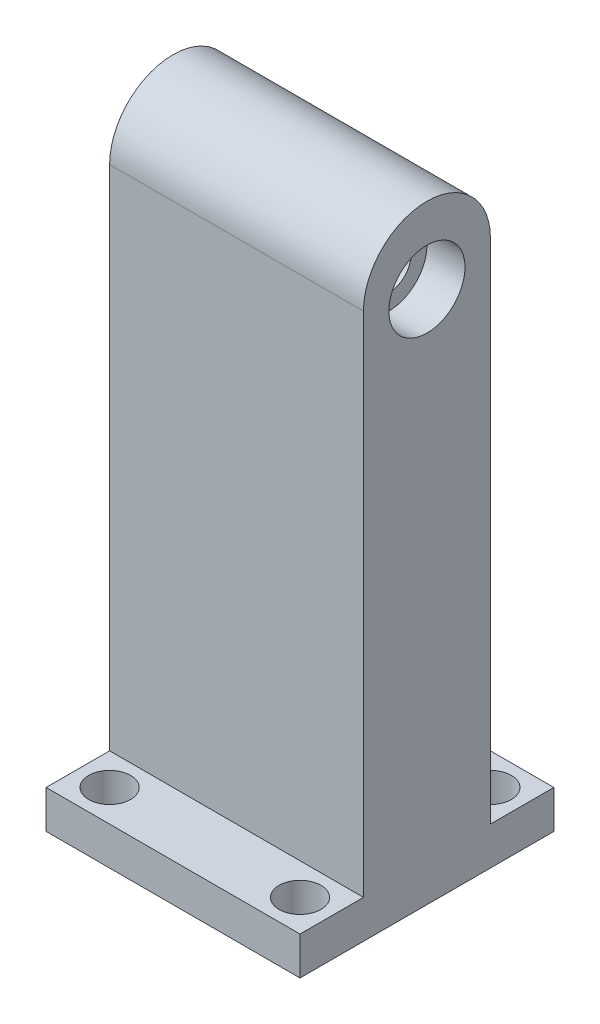
ISO-10303-21;
HEADER;
FILE_DESCRIPTION(('STEP AP214'),'2;1');
FILE_NAME('part.step','',(''),(''),'','','');
FILE_SCHEMA(('AUTOMOTIVE_DESIGN { 1 0 10303 214 1 1 1 1 }'));
ENDSEC;
DATA;
#1=APPLICATION_CONTEXT('core data for automotive mechanical design processes');
#2=APPLICATION_PROTOCOL_DEFINITION('international standard','automotive_design',2000,#1);
#3=PRODUCT_CONTEXT('',#1,'mechanical');
#4=PRODUCT('Part','Part','',(#3));
#5=PRODUCT_RELATED_PRODUCT_CATEGORY('part','',(#4));
#6=PRODUCT_DEFINITION_FORMATION('','',#4);
#7=PRODUCT_DEFINITION_CONTEXT('part definition',#1,'design');
#8=PRODUCT_DEFINITION('design','',#6,#7);
#9=PRODUCT_DEFINITION_SHAPE('','',#8);
#10=(LENGTH_UNIT() NAMED_UNIT(*) SI_UNIT(.MILLI.,.METRE.));
#11=(NAMED_UNIT(*) PLANE_ANGLE_UNIT() SI_UNIT($,.RADIAN.));
#12=(NAMED_UNIT(*) SI_UNIT($,.STERADIAN.) SOLID_ANGLE_UNIT());
#13=UNCERTAINTY_MEASURE_WITH_UNIT(LENGTH_MEASURE(1.E-05),#10,'distance_accuracy_value','');
#14=(GEOMETRIC_REPRESENTATION_CONTEXT(3) GLOBAL_UNCERTAINTY_ASSIGNED_CONTEXT((#13)) GLOBAL_UNIT_ASSIGNED_CONTEXT((#10,
#11,#12)) REPRESENTATION_CONTEXT('',''));
#15=CARTESIAN_POINT('',(0.,0.,0.));
#16=DIRECTION('',(0.,0.,1.));
#17=DIRECTION('',(1.,0.,0.));
#18=AXIS2_PLACEMENT_3D('',#15,#16,#17);
#19=CARTESIAN_POINT('',(-10.,42.,0.));
#20=DIRECTION('',(1.,0.,0.));
#21=DIRECTION('',(0.,0.,-1.));
#22=AXIS2_PLACEMENT_3D('',#19,#20,#21);
#23=CYLINDRICAL_SURFACE('',#22,1.75);
#24=CARTESIAN_POINT('',(7.,42.,0.));
#25=DIRECTION('',(1.,0.,0.));
#26=DIRECTION('',(0.,0.,-1.));
#27=AXIS2_PLACEMENT_3D('',#24,#25,#26);
#28=CIRCLE('',#27,1.75);
#29=CARTESIAN_POINT('',(7.,42.,-1.75));
#30=VERTEX_POINT('',#29);
#31=EDGE_CURVE('E167',#30,#30,#28,.T.);
#32=ORIENTED_EDGE('',*,*,#31,.T.);
#33=EDGE_LOOP('',(#32));
#34=FACE_BOUND('',#33,.T.);
#35=CARTESIAN_POINT('',(-7.,42.,0.));
#36=DIRECTION('',(-1.,0.,0.));
#37=DIRECTION('',(0.,0.,1.));
#38=AXIS2_PLACEMENT_3D('',#35,#36,#37);
#39=CIRCLE('',#38,1.75);
#40=CARTESIAN_POINT('',(-7.,42.,1.75));
#41=VERTEX_POINT('',#40);
#42=EDGE_CURVE('E164',#41,#41,#39,.F.);
#43=ORIENTED_EDGE('',*,*,#42,.F.);
#44=EDGE_LOOP('',(#43));
#45=FACE_BOUND('',#44,.T.);
#46=ADVANCED_FACE('F43',(#34,#45),#23,.F.);
#47=CARTESIAN_POINT('',(10.,52.,-9.99999999999999));
#48=DIRECTION('',(-1.,0.,0.));
#49=DIRECTION('',(0.,0.,1.));
#50=AXIS2_PLACEMENT_3D('',#47,#48,#49);
#51=PLANE('',#50);
#52=CARTESIAN_POINT('',(10.,42.,0.));
#53=DIRECTION('',(1.,0.,0.));
#54=DIRECTION('',(0.,0.,-1.));
#55=AXIS2_PLACEMENT_3D('',#52,#53,#54);
#56=CIRCLE('',#55,3.);
#57=CARTESIAN_POINT('',(10.,42.,-3.));
#58=VERTEX_POINT('',#57);
#59=EDGE_CURVE('E147',#58,#58,#56,.T.);
#60=ORIENTED_EDGE('',*,*,#59,.F.);
#61=EDGE_LOOP('',(#60));
#62=FACE_BOUND('',#61,.T.);
#63=DIRECTION('',(0.,-1.,0.));
#64=VECTOR('',#63,1.);
#65=CARTESIAN_POINT('',(10.,43.,4.99999999999999));
#66=LINE('',#65,#64);
#67=CARTESIAN_POINT('',(10.,43.,4.99999999999999));
#68=VERTEX_POINT('',#67);
#69=CARTESIAN_POINT('',(10.,3.,5.));
#70=VERTEX_POINT('',#69);
#71=EDGE_CURVE('E297',#68,#70,#66,.T.);
#72=ORIENTED_EDGE('',*,*,#71,.T.);
#73=DIRECTION('',(0.,0.,1.));
#74=VECTOR('',#73,1.);
#75=CARTESIAN_POINT('',(10.,3.,5.));
#76=LINE('',#75,#74);
#77=CARTESIAN_POINT('',(10.,3.,10.));
#78=VERTEX_POINT('',#77);
#79=EDGE_CURVE('E131',#70,#78,#76,.T.);
#80=ORIENTED_EDGE('',*,*,#79,.T.);
#81=DIRECTION('',(0.,-1.,0.));
#82=VECTOR('',#81,1.);
#83=CARTESIAN_POINT('',(10.,52.,10.));
#84=LINE('',#83,#82);
#85=CARTESIAN_POINT('',(10.,0.,10.));
#86=VERTEX_POINT('',#85);
#87=EDGE_CURVE('E69',#78,#86,#84,.T.);
#88=ORIENTED_EDGE('',*,*,#87,.T.);
#89=DIRECTION('',(0.,0.,-1.));
#90=VECTOR('',#89,1.);
#91=CARTESIAN_POINT('',(10.,0.,-9.99999999999999));
#92=LINE('',#91,#90);
#93=CARTESIAN_POINT('',(10.,0.,-9.99999999999999));
#94=VERTEX_POINT('',#93);
#95=EDGE_CURVE('E135',#86,#94,#92,.T.);
#96=ORIENTED_EDGE('',*,*,#95,.T.);
#97=DIRECTION('',(0.,-1.,0.));
#98=VECTOR('',#97,1.);
#99=CARTESIAN_POINT('',(10.,52.,-9.99999999999999));
#100=LINE('',#99,#98);
#101=CARTESIAN_POINT('',(10.,3.,-10.));
#102=VERTEX_POINT('',#101);
#103=EDGE_CURVE('E11',#102,#94,#100,.T.);
#104=ORIENTED_EDGE('',*,*,#103,.F.);
#105=DIRECTION('',(0.,0.,1.));
#106=VECTOR('',#105,1.);
#107=CARTESIAN_POINT('',(10.,3.,-10.));
#108=LINE('',#107,#106);
#109=CARTESIAN_POINT('',(10.,3.,-5.));
#110=VERTEX_POINT('',#109);
#111=EDGE_CURVE('E111',#102,#110,#108,.T.);
#112=ORIENTED_EDGE('',*,*,#111,.T.);
#113=DIRECTION('',(0.,1.,0.));
#114=VECTOR('',#113,1.);
#115=CARTESIAN_POINT('',(10.,3.,-5.));
#116=LINE('',#115,#114);
#117=CARTESIAN_POINT('',(10.,43.,-5.00000000000001));
#118=VERTEX_POINT('',#117);
#119=EDGE_CURVE('E123',#110,#118,#116,.T.);
#120=ORIENTED_EDGE('',*,*,#119,.T.);
#121=CARTESIAN_POINT('',(10.,43.,0.));
#122=DIRECTION('',(1.,0.,0.));
#123=DIRECTION('',(0.,0.,-1.));
#124=AXIS2_PLACEMENT_3D('',#121,#122,#123);
#125=CIRCLE('',#124,5.);
#126=EDGE_CURVE('E293',#118,#68,#125,.T.);
#127=ORIENTED_EDGE('',*,*,#126,.T.);
#128=EDGE_LOOP('',(#72,#80,#88,#96,#104,#112,#120,#127));
#129=FACE_BOUND('',#128,.T.);
#130=ADVANCED_FACE('F45',(#62,#129),#51,.F.);
#131=CARTESIAN_POINT('',(-10.,52.,-9.99999999999999));
#132=DIRECTION('',(0.,0.,1.));
#133=DIRECTION('',(1.,0.,0.));
#134=AXIS2_PLACEMENT_3D('',#131,#132,#133);
#135=PLANE('',#134);
#136=DIRECTION('',(0.,-1.,0.));
#137=VECTOR('',#136,1.);
#138=CARTESIAN_POINT('',(-10.,52.,-9.99999999999999));
#139=LINE('',#138,#137);
#140=CARTESIAN_POINT('',(-10.,3.,-9.99999999999999));
#141=VERTEX_POINT('',#140);
#142=CARTESIAN_POINT('',(-10.,0.,-9.99999999999999));
#143=VERTEX_POINT('',#142);
#144=EDGE_CURVE('E53',#141,#143,#139,.T.);
#145=ORIENTED_EDGE('',*,*,#144,.F.);
#146=DIRECTION('',(-1.,0.,0.));
#147=VECTOR('',#146,1.);
#148=CARTESIAN_POINT('',(10.,3.,-10.));
#149=LINE('',#148,#147);
#150=EDGE_CURVE('E116',#102,#141,#149,.T.);
#151=ORIENTED_EDGE('',*,*,#150,.F.);
#152=ORIENTED_EDGE('',*,*,#103,.T.);
#153=DIRECTION('',(-1.,0.,0.));
#154=VECTOR('',#153,1.);
#155=CARTESIAN_POINT('',(-10.,0.,-9.99999999999999));
#156=LINE('',#155,#154);
#157=EDGE_CURVE('E139',#94,#143,#156,.T.);
#158=ORIENTED_EDGE('',*,*,#157,.T.);
#159=EDGE_LOOP('',(#145,#151,#152,#158));
#160=FACE_BOUND('',#159,.T.);
#161=ADVANCED_FACE('F127',(#160),#135,.F.);
#162=CARTESIAN_POINT('',(-10.,52.,-9.99999999999999));
#163=DIRECTION('',(1.,0.,0.));
#164=DIRECTION('',(0.,0.,-1.));
#165=AXIS2_PLACEMENT_3D('',#162,#163,#164);
#166=PLANE('',#165);
#167=CARTESIAN_POINT('',(-10.,42.,0.));
#168=DIRECTION('',(-1.,0.,0.));
#169=DIRECTION('',(0.,0.,1.));
#170=AXIS2_PLACEMENT_3D('',#167,#168,#169);
#171=CIRCLE('',#170,3.);
#172=CARTESIAN_POINT('',(-10.,42.,3.));
#173=VERTEX_POINT('',#172);
#174=EDGE_CURVE('E217',#173,#173,#171,.T.);
#175=ORIENTED_EDGE('',*,*,#174,.F.);
#176=EDGE_LOOP('',(#175));
#177=FACE_BOUND('',#176,.T.);
#178=DIRECTION('',(0.,-1.,0.));
#179=VECTOR('',#178,1.);
#180=CARTESIAN_POINT('',(-10.,52.,10.));
#181=LINE('',#180,#179);
#182=CARTESIAN_POINT('',(-10.,3.00000000000002,10.));
#183=VERTEX_POINT('',#182);
#184=CARTESIAN_POINT('',(-10.,0.,10.));
#185=VERTEX_POINT('',#184);
#186=EDGE_CURVE('E159',#183,#185,#181,.T.);
#187=ORIENTED_EDGE('',*,*,#186,.F.);
#188=DIRECTION('',(0.,0.,1.));
#189=VECTOR('',#188,1.);
#190=CARTESIAN_POINT('',(-10.,3.,5.));
#191=LINE('',#190,#189);
#192=CARTESIAN_POINT('',(-10.,3.,5.));
#193=VERTEX_POINT('',#192);
#194=EDGE_CURVE('E61',#193,#183,#191,.T.);
#195=ORIENTED_EDGE('',*,*,#194,.F.);
#196=DIRECTION('',(0.,-1.,0.));
#197=VECTOR('',#196,1.);
#198=CARTESIAN_POINT('',(-10.,43.,4.99999999999999));
#199=LINE('',#198,#197);
#200=CARTESIAN_POINT('',(-10.,43.,4.99999999999999));
#201=VERTEX_POINT('',#200);
#202=EDGE_CURVE('E286',#201,#193,#199,.T.);
#203=ORIENTED_EDGE('',*,*,#202,.F.);
#204=CARTESIAN_POINT('',(-10.,43.,0.));
#205=DIRECTION('',(1.,0.,0.));
#206=DIRECTION('',(0.,0.,-1.));
#207=AXIS2_PLACEMENT_3D('',#204,#205,#206);
#208=CIRCLE('',#207,5.);
#209=CARTESIAN_POINT('',(-10.,43.,-5.00000000000001));
#210=VERTEX_POINT('',#209);
#211=EDGE_CURVE('E279',#210,#201,#208,.T.);
#212=ORIENTED_EDGE('',*,*,#211,.F.);
#213=DIRECTION('',(0.,1.,0.));
#214=VECTOR('',#213,1.);
#215=CARTESIAN_POINT('',(-10.,3.,-5.));
#216=LINE('',#215,#214);
#217=CARTESIAN_POINT('',(-10.,3.,-5.));
#218=VERTEX_POINT('',#217);
#219=EDGE_CURVE('E275',#218,#210,#216,.T.);
#220=ORIENTED_EDGE('',*,*,#219,.F.);
#221=DIRECTION('',(0.,0.,1.));
#222=VECTOR('',#221,1.);
#223=CARTESIAN_POINT('',(-10.,3.,-9.99999999999999));
#224=LINE('',#223,#222);
#225=EDGE_CURVE('E272',#141,#218,#224,.T.);
#226=ORIENTED_EDGE('',*,*,#225,.F.);
#227=ORIENTED_EDGE('',*,*,#144,.T.);
#228=DIRECTION('',(0.,0.,1.));
#229=VECTOR('',#228,1.);
#230=CARTESIAN_POINT('',(-10.,0.,-9.99999999999999));
#231=LINE('',#230,#229);
#232=EDGE_CURVE('E144',#143,#185,#231,.T.);
#233=ORIENTED_EDGE('',*,*,#232,.T.);
#234=EDGE_LOOP('',(#187,#195,#203,#212,#220,#226,#227,#233));
#235=FACE_BOUND('',#234,.T.);
#236=ADVANCED_FACE('F239',(#177,#235),#166,.F.);
#237=CARTESIAN_POINT('',(-10.,52.,10.));
#238=DIRECTION('',(0.,0.,-1.));
#239=DIRECTION('',(-1.,0.,0.));
#240=AXIS2_PLACEMENT_3D('',#237,#238,#239);
#241=PLANE('',#240);
#242=ORIENTED_EDGE('',*,*,#87,.F.);
#243=DIRECTION('',(-1.,0.,0.));
#244=VECTOR('',#243,1.);
#245=CARTESIAN_POINT('',(10.,3.,10.));
#246=LINE('',#245,#244);
#247=EDGE_CURVE('E173',#78,#183,#246,.T.);
#248=ORIENTED_EDGE('',*,*,#247,.T.);
#249=ORIENTED_EDGE('',*,*,#186,.T.);
#250=DIRECTION('',(1.,0.,0.));
#251=VECTOR('',#250,1.);
#252=CARTESIAN_POINT('',(-10.,0.,10.));
#253=LINE('',#252,#251);
#254=EDGE_CURVE('E154',#185,#86,#253,.T.);
#255=ORIENTED_EDGE('',*,*,#254,.T.);
#256=EDGE_LOOP('',(#242,#248,#249,#255));
#257=FACE_BOUND('',#256,.T.);
#258=ADVANCED_FACE('F259',(#257),#241,.F.);
#259=CARTESIAN_POINT('',(0.,0.,0.));
#260=DIRECTION('',(0.,1.,0.));
#261=DIRECTION('',(0.,0.,1.));
#262=AXIS2_PLACEMENT_3D('',#259,#260,#261);
#263=PLANE('',#262);
#264=CARTESIAN_POINT('',(-7.5,0.,7.50000000000001));
#265=DIRECTION('',(0.,1.,0.));
#266=DIRECTION('',(0.,0.,1.));
#267=AXIS2_PLACEMENT_3D('',#264,#265,#266);
#268=CIRCLE('',#267,1.64955961301493);
#269=CARTESIAN_POINT('',(-7.5,0.,9.14955961301494));
#270=VERTEX_POINT('',#269);
#271=EDGE_CURVE('E201',#270,#270,#268,.T.);
#272=ORIENTED_EDGE('',*,*,#271,.T.);
#273=EDGE_LOOP('',(#272));
#274=FACE_BOUND('',#273,.T.);
#275=CARTESIAN_POINT('',(7.5,0.,7.50000000000001));
#276=DIRECTION('',(0.,1.,0.));
#277=DIRECTION('',(0.,0.,1.));
#278=AXIS2_PLACEMENT_3D('',#275,#276,#277);
#279=CIRCLE('',#278,1.64955961301494);
#280=CARTESIAN_POINT('',(7.5,0.,9.14955961301494));
#281=VERTEX_POINT('',#280);
#282=EDGE_CURVE('E207',#281,#281,#279,.T.);
#283=ORIENTED_EDGE('',*,*,#282,.T.);
#284=EDGE_LOOP('',(#283));
#285=FACE_BOUND('',#284,.T.);
#286=CARTESIAN_POINT('',(7.5,0.,-7.49999999999999));
#287=DIRECTION('',(0.,1.,0.));
#288=DIRECTION('',(0.,0.,1.));
#289=AXIS2_PLACEMENT_3D('',#286,#287,#288);
#290=CIRCLE('',#289,1.64955961301494);
#291=CARTESIAN_POINT('',(7.5,0.,-5.85044038698506));
#292=VERTEX_POINT('',#291);
#293=EDGE_CURVE('E202',#292,#292,#290,.T.);
#294=ORIENTED_EDGE('',*,*,#293,.T.);
#295=EDGE_LOOP('',(#294));
#296=FACE_BOUND('',#295,.T.);
#297=CARTESIAN_POINT('',(-7.5,0.,-7.49999999999999));
#298=DIRECTION('',(0.,1.,0.));
#299=DIRECTION('',(0.,0.,1.));
#300=AXIS2_PLACEMENT_3D('',#297,#298,#299);
#301=CIRCLE('',#300,1.64955961301493);
#302=CARTESIAN_POINT('',(-7.5,0.,-5.85044038698506));
#303=VERTEX_POINT('',#302);
#304=EDGE_CURVE('E206',#303,#303,#301,.T.);
#305=ORIENTED_EDGE('',*,*,#304,.T.);
#306=EDGE_LOOP('',(#305));
#307=FACE_BOUND('',#306,.T.);
#308=ORIENTED_EDGE('',*,*,#95,.F.);
#309=ORIENTED_EDGE('',*,*,#254,.F.);
#310=ORIENTED_EDGE('',*,*,#232,.F.);
#311=ORIENTED_EDGE('',*,*,#157,.F.);
#312=EDGE_LOOP('',(#308,#309,#310,#311));
#313=FACE_BOUND('',#312,.T.);
#314=ADVANCED_FACE('F255',(#274,#285,#296,#307,#313),#263,.F.);
#315=CARTESIAN_POINT('',(7.,42.,0.));
#316=DIRECTION('',(1.,0.,0.));
#317=DIRECTION('',(0.,0.,-1.));
#318=AXIS2_PLACEMENT_3D('',#315,#316,#317);
#319=CYLINDRICAL_SURFACE('',#318,3.);
#320=CARTESIAN_POINT('',(7.,42.,0.));
#321=DIRECTION('',(1.,0.,0.));
#322=DIRECTION('',(0.,0.,-1.));
#323=AXIS2_PLACEMENT_3D('',#320,#321,#322);
#324=CIRCLE('',#323,3.);
#325=CARTESIAN_POINT('',(7.,42.,-3.));
#326=VERTEX_POINT('',#325);
#327=EDGE_CURVE('E140',#326,#326,#324,.T.);
#328=ORIENTED_EDGE('',*,*,#327,.F.);
#329=EDGE_LOOP('',(#328));
#330=FACE_BOUND('',#329,.T.);
#331=ORIENTED_EDGE('',*,*,#59,.T.);
#332=EDGE_LOOP('',(#331));
#333=FACE_BOUND('',#332,.T.);
#334=ADVANCED_FACE('F232',(#330,#333),#319,.F.);
#335=CARTESIAN_POINT('',(7.,42.,0.));
#336=DIRECTION('',(1.,0.,0.));
#337=DIRECTION('',(0.,0.,-1.));
#338=AXIS2_PLACEMENT_3D('',#335,#336,#337);
#339=PLANE('',#338);
#340=ORIENTED_EDGE('',*,*,#31,.F.);
#341=EDGE_LOOP('',(#340));
#342=FACE_BOUND('',#341,.T.);
#343=ORIENTED_EDGE('',*,*,#327,.T.);
#344=EDGE_LOOP('',(#343));
#345=FACE_BOUND('',#344,.T.);
#346=ADVANCED_FACE('F248',(#342,#345),#339,.T.);
#347=CARTESIAN_POINT('',(-7.,42.,0.));
#348=DIRECTION('',(-1.,0.,0.));
#349=DIRECTION('',(0.,0.,1.));
#350=AXIS2_PLACEMENT_3D('',#347,#348,#349);
#351=PLANE('',#350);
#352=CARTESIAN_POINT('',(-7.,42.,0.));
#353=DIRECTION('',(-1.,0.,0.));
#354=DIRECTION('',(0.,0.,1.));
#355=AXIS2_PLACEMENT_3D('',#352,#353,#354);
#356=CIRCLE('',#355,3.);
#357=CARTESIAN_POINT('',(-7.,42.,3.));
#358=VERTEX_POINT('',#357);
#359=EDGE_CURVE('E168',#358,#358,#356,.T.);
#360=ORIENTED_EDGE('',*,*,#359,.T.);
#361=EDGE_LOOP('',(#360));
#362=FACE_BOUND('',#361,.T.);
#363=ORIENTED_EDGE('',*,*,#42,.T.);
#364=EDGE_LOOP('',(#363));
#365=FACE_BOUND('',#364,.T.);
#366=ADVANCED_FACE('F251',(#362,#365),#351,.T.);
#367=CARTESIAN_POINT('',(-7.,42.,0.));
#368=DIRECTION('',(-1.,0.,0.));
#369=DIRECTION('',(0.,0.,1.));
#370=AXIS2_PLACEMENT_3D('',#367,#368,#369);
#371=CYLINDRICAL_SURFACE('',#370,3.);
#372=ORIENTED_EDGE('',*,*,#359,.F.);
#373=EDGE_LOOP('',(#372));
#374=FACE_BOUND('',#373,.T.);
#375=ORIENTED_EDGE('',*,*,#174,.T.);
#376=EDGE_LOOP('',(#375));
#377=FACE_BOUND('',#376,.T.);
#378=ADVANCED_FACE('F246',(#374,#377),#371,.F.);
#379=CARTESIAN_POINT('',(-7.5,0.,-7.49999999999999));
#380=DIRECTION('',(0.,1.,0.));
#381=DIRECTION('',(0.,0.,1.));
#382=AXIS2_PLACEMENT_3D('',#379,#380,#381);
#383=CYLINDRICAL_SURFACE('',#382,1.64955961301493);
#384=CARTESIAN_POINT('',(-7.5,3.,-7.49999999999999));
#385=DIRECTION('',(0.,-1.,0.));
#386=DIRECTION('',(0.,0.,-1.));
#387=AXIS2_PLACEMENT_3D('',#384,#385,#386);
#388=CIRCLE('',#387,1.64955961301493);
#389=CARTESIAN_POINT('',(-7.5,3.,-5.85044038698506));
#390=VERTEX_POINT('',#389);
#391=EDGE_CURVE('E197',#390,#390,#388,.F.);
#392=CARTESIAN_POINT('',(-7.5,3.,-5.85044038698506));
#393=CARTESIAN_POINT('',(-7.5,2.96875,-5.85044038698506));
#394=CARTESIAN_POINT('',(-7.5,2.9375,-5.85044038698506));
#395=CARTESIAN_POINT('',(-7.5,2.875,-5.85044038698506));
#396=CARTESIAN_POINT('',(-7.5,2.84375,-5.85044038698506));
#397=CARTESIAN_POINT('',(-7.5,2.78125,-5.85044038698506));
#398=CARTESIAN_POINT('',(-7.5,2.75,-5.85044038698506));
#399=CARTESIAN_POINT('',(-7.5,2.6875,-5.85044038698506));
#400=CARTESIAN_POINT('',(-7.5,2.65625,-5.85044038698506));
#401=CARTESIAN_POINT('',(-7.5,2.59375,-5.85044038698506));
#402=CARTESIAN_POINT('',(-7.5,2.5625,-5.85044038698506));
#403=CARTESIAN_POINT('',(-7.5,2.5,-5.85044038698506));
#404=CARTESIAN_POINT('',(-7.5,2.46875,-5.85044038698506));
#405=CARTESIAN_POINT('',(-7.5,2.40625,-5.85044038698506));
#406=CARTESIAN_POINT('',(-7.5,2.375,-5.85044038698506));
#407=CARTESIAN_POINT('',(-7.5,2.3125,-5.85044038698506));
#408=CARTESIAN_POINT('',(-7.5,2.28125,-5.85044038698506));
#409=CARTESIAN_POINT('',(-7.5,2.21875,-5.85044038698506));
#410=CARTESIAN_POINT('',(-7.5,2.1875,-5.85044038698506));
#411=CARTESIAN_POINT('',(-7.5,2.125,-5.85044038698506));
#412=CARTESIAN_POINT('',(-7.5,2.09375,-5.85044038698506));
#413=CARTESIAN_POINT('',(-7.5,2.03125,-5.85044038698506));
#414=CARTESIAN_POINT('',(-7.5,2.,-5.85044038698506));
#415=CARTESIAN_POINT('',(-7.5,1.9375,-5.85044038698506));
#416=CARTESIAN_POINT('',(-7.5,1.90625,-5.85044038698506));
#417=CARTESIAN_POINT('',(-7.5,1.84375,-5.85044038698506));
#418=CARTESIAN_POINT('',(-7.5,1.8125,-5.85044038698506));
#419=CARTESIAN_POINT('',(-7.5,1.75,-5.85044038698506));
#420=CARTESIAN_POINT('',(-7.5,1.71875,-5.85044038698506));
#421=CARTESIAN_POINT('',(-7.5,1.65625,-5.85044038698506));
#422=CARTESIAN_POINT('',(-7.5,1.625,-5.85044038698506));
#423=CARTESIAN_POINT('',(-7.5,1.5625,-5.85044038698506));
#424=CARTESIAN_POINT('',(-7.5,1.53125,-5.85044038698506));
#425=CARTESIAN_POINT('',(-7.5,1.46875,-5.85044038698506));
#426=CARTESIAN_POINT('',(-7.5,1.4375,-5.85044038698506));
#427=CARTESIAN_POINT('',(-7.5,1.375,-5.85044038698506));
#428=CARTESIAN_POINT('',(-7.5,1.34375,-5.85044038698506));
#429=CARTESIAN_POINT('',(-7.5,1.28125,-5.85044038698506));
#430=CARTESIAN_POINT('',(-7.5,1.25,-5.85044038698506));
#431=CARTESIAN_POINT('',(-7.5,1.1875,-5.85044038698506));
#432=CARTESIAN_POINT('',(-7.5,1.15625,-5.85044038698506));
#433=CARTESIAN_POINT('',(-7.5,1.09375,-5.85044038698506));
#434=CARTESIAN_POINT('',(-7.5,1.0625,-5.85044038698506));
#435=CARTESIAN_POINT('',(-7.5,1.,-5.85044038698506));
#436=CARTESIAN_POINT('',(-7.5,0.96875,-5.85044038698506));
#437=CARTESIAN_POINT('',(-7.5,0.90625,-5.85044038698506));
#438=CARTESIAN_POINT('',(-7.5,0.875,-5.85044038698506));
#439=CARTESIAN_POINT('',(-7.5,0.8125,-5.85044038698506));
#440=CARTESIAN_POINT('',(-7.5,0.78125,-5.85044038698506));
#441=CARTESIAN_POINT('',(-7.5,0.71875,-5.85044038698506));
#442=CARTESIAN_POINT('',(-7.5,0.6875,-5.85044038698506));
#443=CARTESIAN_POINT('',(-7.5,0.625,-5.85044038698506));
#444=CARTESIAN_POINT('',(-7.5,0.59375,-5.85044038698506));
#445=CARTESIAN_POINT('',(-7.5,0.53125,-5.85044038698506));
#446=CARTESIAN_POINT('',(-7.5,0.5,-5.85044038698506));
#447=CARTESIAN_POINT('',(-7.5,0.4375,-5.85044038698506));
#448=CARTESIAN_POINT('',(-7.5,0.40625,-5.85044038698506));
#449=CARTESIAN_POINT('',(-7.5,0.34375,-5.85044038698506));
#450=CARTESIAN_POINT('',(-7.5,0.3125,-5.85044038698506));
#451=CARTESIAN_POINT('',(-7.5,0.25,-5.85044038698506));
#452=CARTESIAN_POINT('',(-7.5,0.21875,-5.85044038698506));
#453=CARTESIAN_POINT('',(-7.5,0.15625,-5.85044038698506));
#454=CARTESIAN_POINT('',(-7.5,0.125,-5.85044038698506));
#455=CARTESIAN_POINT('',(-7.5,0.0625000000000001,-5.85044038698506));
#456=CARTESIAN_POINT('',(-7.5,0.03125,-5.85044038698506));
#457=CARTESIAN_POINT('',(-7.5,0.,-5.85044038698506));
#458=B_SPLINE_CURVE_WITH_KNOTS('',3,(#392,#393,#394,#395,#396,#397,#398,#399,#400,#401,#402,
#403,#404,#405,#406,#407,#408,#409,#410,#411,#412,#413,#414,#415,#416,#417,#418,#419,#420,#421,
#422,#423,#424,#425,#426,#427,#428,#429,#430,#431,#432,#433,#434,#435,#436,#437,#438,#439,#440,
#441,#442,#443,#444,#445,#446,#447,#448,#449,#450,#451,#452,#453,#454,#455,#456,#457),
.UNSPECIFIED.,.F.,.F.,(4,2,2,2,2,2,2,2,2,2,2,2,2,2,2,2,2,2,2,2,2,2,2,2,2,2,2,2,2,2,2,2,4),(0.,
0.0937500000000001,0.1875,0.28125,0.375,0.46875,0.5625,0.65625,0.75,0.84375,0.9375,1.03125,
1.125,1.21875,1.3125,1.40625,1.5,1.59375,1.6875,1.78125,1.875,1.96875,2.0625,2.15625,2.25,
2.34375,2.4375,2.53125,2.625,2.71875,2.8125,2.90625,3.),.UNSPECIFIED.);
#459=EDGE_CURVE('BSEAM326',#390,#303,#458,.T.);
#460=ORIENTED_EDGE('',*,*,#391,.T.);
#461=ORIENTED_EDGE('',*,*,#304,.F.);
#462=ORIENTED_EDGE('',*,*,#459,.T.);
#463=ORIENTED_EDGE('',*,*,#459,.F.);
#464=EDGE_LOOP('',(#460,#462,#461,#463));
#465=FACE_BOUND('',#464,.T.);
#466=ADVANCED_FACE('F326',(#465),#383,.F.);
#467=CARTESIAN_POINT('',(7.5,0.,-7.49999999999999));
#468=DIRECTION('',(0.,1.,0.));
#469=DIRECTION('',(0.,0.,1.));
#470=AXIS2_PLACEMENT_3D('',#467,#468,#469);
#471=CYLINDRICAL_SURFACE('',#470,1.64955961301494);
#472=CARTESIAN_POINT('',(7.5,3.,-7.49999999999999));
#473=DIRECTION('',(0.,-1.,0.));
#474=DIRECTION('',(0.,0.,-1.));
#475=AXIS2_PLACEMENT_3D('',#472,#473,#474);
#476=CIRCLE('',#475,1.64955961301494);
#477=CARTESIAN_POINT('',(7.5,3.,-5.85044038698506));
#478=VERTEX_POINT('',#477);
#479=EDGE_CURVE('E47',#478,#478,#476,.F.);
#480=CARTESIAN_POINT('',(7.5,3.,-5.85044038698506));
#481=CARTESIAN_POINT('',(7.5,2.96875,-5.85044038698506));
#482=CARTESIAN_POINT('',(7.5,2.9375,-5.85044038698506));
#483=CARTESIAN_POINT('',(7.5,2.875,-5.85044038698506));
#484=CARTESIAN_POINT('',(7.5,2.84375,-5.85044038698506));
#485=CARTESIAN_POINT('',(7.5,2.78125,-5.85044038698506));
#486=CARTESIAN_POINT('',(7.5,2.75,-5.85044038698506));
#487=CARTESIAN_POINT('',(7.5,2.6875,-5.85044038698506));
#488=CARTESIAN_POINT('',(7.5,2.65625,-5.85044038698506));
#489=CARTESIAN_POINT('',(7.5,2.59375,-5.85044038698506));
#490=CARTESIAN_POINT('',(7.5,2.5625,-5.85044038698506));
#491=CARTESIAN_POINT('',(7.5,2.5,-5.85044038698506));
#492=CARTESIAN_POINT('',(7.5,2.46875,-5.85044038698506));
#493=CARTESIAN_POINT('',(7.5,2.40625,-5.85044038698506));
#494=CARTESIAN_POINT('',(7.5,2.375,-5.85044038698506));
#495=CARTESIAN_POINT('',(7.5,2.3125,-5.85044038698506));
#496=CARTESIAN_POINT('',(7.5,2.28125,-5.85044038698506));
#497=CARTESIAN_POINT('',(7.5,2.21875,-5.85044038698506));
#498=CARTESIAN_POINT('',(7.5,2.1875,-5.85044038698506));
#499=CARTESIAN_POINT('',(7.5,2.125,-5.85044038698506));
#500=CARTESIAN_POINT('',(7.5,2.09375,-5.85044038698506));
#501=CARTESIAN_POINT('',(7.5,2.03125,-5.85044038698506));
#502=CARTESIAN_POINT('',(7.5,2.,-5.85044038698506));
#503=CARTESIAN_POINT('',(7.5,1.9375,-5.85044038698506));
#504=CARTESIAN_POINT('',(7.5,1.90625,-5.85044038698506));
#505=CARTESIAN_POINT('',(7.5,1.84375,-5.85044038698506));
#506=CARTESIAN_POINT('',(7.5,1.8125,-5.85044038698506));
#507=CARTESIAN_POINT('',(7.5,1.75,-5.85044038698506));
#508=CARTESIAN_POINT('',(7.5,1.71875,-5.85044038698506));
#509=CARTESIAN_POINT('',(7.5,1.65625,-5.85044038698506));
#510=CARTESIAN_POINT('',(7.5,1.625,-5.85044038698506));
#511=CARTESIAN_POINT('',(7.5,1.5625,-5.85044038698506));
#512=CARTESIAN_POINT('',(7.5,1.53125,-5.85044038698506));
#513=CARTESIAN_POINT('',(7.5,1.46875,-5.85044038698506));
#514=CARTESIAN_POINT('',(7.5,1.4375,-5.85044038698506));
#515=CARTESIAN_POINT('',(7.5,1.375,-5.85044038698506));
#516=CARTESIAN_POINT('',(7.5,1.34375,-5.85044038698506));
#517=CARTESIAN_POINT('',(7.5,1.28125,-5.85044038698506));
#518=CARTESIAN_POINT('',(7.5,1.25,-5.85044038698506));
#519=CARTESIAN_POINT('',(7.5,1.1875,-5.85044038698506));
#520=CARTESIAN_POINT('',(7.5,1.15625,-5.85044038698506));
#521=CARTESIAN_POINT('',(7.5,1.09375,-5.85044038698506));
#522=CARTESIAN_POINT('',(7.5,1.0625,-5.85044038698506));
#523=CARTESIAN_POINT('',(7.5,1.,-5.85044038698506));
#524=CARTESIAN_POINT('',(7.5,0.96875,-5.85044038698506));
#525=CARTESIAN_POINT('',(7.5,0.90625,-5.85044038698506));
#526=CARTESIAN_POINT('',(7.5,0.875,-5.85044038698506));
#527=CARTESIAN_POINT('',(7.5,0.8125,-5.85044038698506));
#528=CARTESIAN_POINT('',(7.5,0.78125,-5.85044038698506));
#529=CARTESIAN_POINT('',(7.5,0.71875,-5.85044038698506));
#530=CARTESIAN_POINT('',(7.5,0.6875,-5.85044038698506));
#531=CARTESIAN_POINT('',(7.5,0.625,-5.85044038698506));
#532=CARTESIAN_POINT('',(7.5,0.59375,-5.85044038698506));
#533=CARTESIAN_POINT('',(7.5,0.53125,-5.85044038698506));
#534=CARTESIAN_POINT('',(7.5,0.5,-5.85044038698506));
#535=CARTESIAN_POINT('',(7.5,0.4375,-5.85044038698506));
#536=CARTESIAN_POINT('',(7.5,0.40625,-5.85044038698506));
#537=CARTESIAN_POINT('',(7.5,0.34375,-5.85044038698506));
#538=CARTESIAN_POINT('',(7.5,0.3125,-5.85044038698506));
#539=CARTESIAN_POINT('',(7.5,0.25,-5.85044038698506));
#540=CARTESIAN_POINT('',(7.5,0.21875,-5.85044038698506));
#541=CARTESIAN_POINT('',(7.5,0.15625,-5.85044038698506));
#542=CARTESIAN_POINT('',(7.5,0.125,-5.85044038698506));
#543=CARTESIAN_POINT('',(7.5,0.0625000000000001,-5.85044038698506));
#544=CARTESIAN_POINT('',(7.5,0.03125,-5.85044038698506));
#545=CARTESIAN_POINT('',(7.5,0.,-5.85044038698506));
#546=B_SPLINE_CURVE_WITH_KNOTS('',3,(#480,#481,#482,#483,#484,#485,#486,#487,#488,#489,#490,
#491,#492,#493,#494,#495,#496,#497,#498,#499,#500,#501,#502,#503,#504,#505,#506,#507,#508,#509,
#510,#511,#512,#513,#514,#515,#516,#517,#518,#519,#520,#521,#522,#523,#524,#525,#526,#527,#528,
#529,#530,#531,#532,#533,#534,#535,#536,#537,#538,#539,#540,#541,#542,#543,#544,#545),
.UNSPECIFIED.,.F.,.F.,(4,2,2,2,2,2,2,2,2,2,2,2,2,2,2,2,2,2,2,2,2,2,2,2,2,2,2,2,2,2,2,2,4),(0.,
0.0937500000000001,0.1875,0.28125,0.375,0.46875,0.5625,0.65625,0.75,0.84375,0.9375,1.03125,
1.125,1.21875,1.3125,1.40625,1.5,1.59375,1.6875,1.78125,1.875,1.96875,2.0625,2.15625,2.25,
2.34375,2.4375,2.53125,2.625,2.71875,2.8125,2.90625,3.),.UNSPECIFIED.);
#547=EDGE_CURVE('BSEAM322',#478,#292,#546,.T.);
#548=ORIENTED_EDGE('',*,*,#479,.T.);
#549=ORIENTED_EDGE('',*,*,#293,.F.);
#550=ORIENTED_EDGE('',*,*,#547,.T.);
#551=ORIENTED_EDGE('',*,*,#547,.F.);
#552=EDGE_LOOP('',(#548,#550,#549,#551));
#553=FACE_BOUND('',#552,.T.);
#554=ADVANCED_FACE('F322',(#553),#471,.F.);
#555=CARTESIAN_POINT('',(7.5,0.,7.50000000000001));
#556=DIRECTION('',(0.,1.,0.));
#557=DIRECTION('',(0.,0.,1.));
#558=AXIS2_PLACEMENT_3D('',#555,#556,#557);
#559=CYLINDRICAL_SURFACE('',#558,1.64955961301494);
#560=CARTESIAN_POINT('',(7.5,3.,7.50000000000001));
#561=DIRECTION('',(0.,-1.,0.));
#562=DIRECTION('',(0.,0.,-1.));
#563=AXIS2_PLACEMENT_3D('',#560,#561,#562);
#564=CIRCLE('',#563,1.64955961301494);
#565=CARTESIAN_POINT('',(7.5,3.,9.14955961301494));
#566=VERTEX_POINT('',#565);
#567=EDGE_CURVE('E172',#566,#566,#564,.F.);
#568=CARTESIAN_POINT('',(7.5,3.,9.14955961301494));
#569=CARTESIAN_POINT('',(7.5,2.96875,9.14955961301494));
#570=CARTESIAN_POINT('',(7.5,2.9375,9.14955961301494));
#571=CARTESIAN_POINT('',(7.5,2.875,9.14955961301494));
#572=CARTESIAN_POINT('',(7.5,2.84375,9.14955961301494));
#573=CARTESIAN_POINT('',(7.5,2.78125,9.14955961301494));
#574=CARTESIAN_POINT('',(7.5,2.75,9.14955961301494));
#575=CARTESIAN_POINT('',(7.5,2.6875,9.14955961301494));
#576=CARTESIAN_POINT('',(7.5,2.65625,9.14955961301494));
#577=CARTESIAN_POINT('',(7.5,2.59375,9.14955961301494));
#578=CARTESIAN_POINT('',(7.5,2.5625,9.14955961301494));
#579=CARTESIAN_POINT('',(7.5,2.5,9.14955961301494));
#580=CARTESIAN_POINT('',(7.5,2.46875,9.14955961301494));
#581=CARTESIAN_POINT('',(7.5,2.40625,9.14955961301494));
#582=CARTESIAN_POINT('',(7.5,2.375,9.14955961301494));
#583=CARTESIAN_POINT('',(7.5,2.3125,9.14955961301494));
#584=CARTESIAN_POINT('',(7.5,2.28125,9.14955961301494));
#585=CARTESIAN_POINT('',(7.5,2.21875,9.14955961301494));
#586=CARTESIAN_POINT('',(7.5,2.1875,9.14955961301494));
#587=CARTESIAN_POINT('',(7.5,2.125,9.14955961301494));
#588=CARTESIAN_POINT('',(7.5,2.09375,9.14955961301494));
#589=CARTESIAN_POINT('',(7.5,2.03125,9.14955961301494));
#590=CARTESIAN_POINT('',(7.5,2.,9.14955961301494));
#591=CARTESIAN_POINT('',(7.5,1.9375,9.14955961301494));
#592=CARTESIAN_POINT('',(7.5,1.90625,9.14955961301494));
#593=CARTESIAN_POINT('',(7.5,1.84375,9.14955961301494));
#594=CARTESIAN_POINT('',(7.5,1.8125,9.14955961301494));
#595=CARTESIAN_POINT('',(7.5,1.75,9.14955961301494));
#596=CARTESIAN_POINT('',(7.5,1.71875,9.14955961301494));
#597=CARTESIAN_POINT('',(7.5,1.65625,9.14955961301494));
#598=CARTESIAN_POINT('',(7.5,1.625,9.14955961301494));
#599=CARTESIAN_POINT('',(7.5,1.5625,9.14955961301494));
#600=CARTESIAN_POINT('',(7.5,1.53125,9.14955961301494));
#601=CARTESIAN_POINT('',(7.5,1.46875,9.14955961301494));
#602=CARTESIAN_POINT('',(7.5,1.4375,9.14955961301494));
#603=CARTESIAN_POINT('',(7.5,1.375,9.14955961301494));
#604=CARTESIAN_POINT('',(7.5,1.34375,9.14955961301494));
#605=CARTESIAN_POINT('',(7.5,1.28125,9.14955961301494));
#606=CARTESIAN_POINT('',(7.5,1.25,9.14955961301494));
#607=CARTESIAN_POINT('',(7.5,1.1875,9.14955961301494));
#608=CARTESIAN_POINT('',(7.5,1.15625,9.14955961301494));
#609=CARTESIAN_POINT('',(7.5,1.09375,9.14955961301494));
#610=CARTESIAN_POINT('',(7.5,1.0625,9.14955961301494));
#611=CARTESIAN_POINT('',(7.5,1.,9.14955961301494));
#612=CARTESIAN_POINT('',(7.5,0.96875,9.14955961301494));
#613=CARTESIAN_POINT('',(7.5,0.90625,9.14955961301494));
#614=CARTESIAN_POINT('',(7.5,0.875,9.14955961301494));
#615=CARTESIAN_POINT('',(7.5,0.8125,9.14955961301494));
#616=CARTESIAN_POINT('',(7.5,0.78125,9.14955961301494));
#617=CARTESIAN_POINT('',(7.5,0.718750000000001,9.14955961301494));
#618=CARTESIAN_POINT('',(7.5,0.687500000000001,9.14955961301494));
#619=CARTESIAN_POINT('',(7.5,0.625,9.14955961301494));
#620=CARTESIAN_POINT('',(7.5,0.59375,9.14955961301494));
#621=CARTESIAN_POINT('',(7.5,0.53125,9.14955961301494));
#622=CARTESIAN_POINT('',(7.5,0.5,9.14955961301494));
#623=CARTESIAN_POINT('',(7.5,0.4375,9.14955961301494));
#624=CARTESIAN_POINT('',(7.5,0.40625,9.14955961301494));
#625=CARTESIAN_POINT('',(7.5,0.34375,9.14955961301494));
#626=CARTESIAN_POINT('',(7.5,0.3125,9.14955961301494));
#627=CARTESIAN_POINT('',(7.5,0.25,9.14955961301494));
#628=CARTESIAN_POINT('',(7.5,0.21875,9.14955961301494));
#629=CARTESIAN_POINT('',(7.5,0.15625,9.14955961301494));
#630=CARTESIAN_POINT('',(7.5,0.125,9.14955961301494));
#631=CARTESIAN_POINT('',(7.5,0.0625000000000001,9.14955961301494));
#632=CARTESIAN_POINT('',(7.5,0.03125,9.14955961301494));
#633=CARTESIAN_POINT('',(7.5,0.,9.14955961301494));
#634=B_SPLINE_CURVE_WITH_KNOTS('',3,(#568,#569,#570,#571,#572,#573,#574,#575,#576,#577,#578,
#579,#580,#581,#582,#583,#584,#585,#586,#587,#588,#589,#590,#591,#592,#593,#594,#595,#596,#597,
#598,#599,#600,#601,#602,#603,#604,#605,#606,#607,#608,#609,#610,#611,#612,#613,#614,#615,#616,
#617,#618,#619,#620,#621,#622,#623,#624,#625,#626,#627,#628,#629,#630,#631,#632,#633),
.UNSPECIFIED.,.F.,.F.,(4,2,2,2,2,2,2,2,2,2,2,2,2,2,2,2,2,2,2,2,2,2,2,2,2,2,2,2,2,2,2,2,4),(0.,
0.0937500000000001,0.1875,0.28125,0.375,0.46875,0.5625,0.656250000000001,0.750000000000001,
0.843750000000001,0.937500000000001,1.03125,1.125,1.21875,1.3125,1.40625,1.5,1.59375,1.6875,
1.78125,1.875,1.96875,2.0625,2.15625,2.25,2.34375,2.4375,2.53125,2.625,2.71875,2.8125,2.90625,
3.),.UNSPECIFIED.);
#635=EDGE_CURVE('BSEAM325',#566,#281,#634,.T.);
#636=ORIENTED_EDGE('',*,*,#567,.T.);
#637=ORIENTED_EDGE('',*,*,#282,.F.);
#638=ORIENTED_EDGE('',*,*,#635,.T.);
#639=ORIENTED_EDGE('',*,*,#635,.F.);
#640=EDGE_LOOP('',(#636,#638,#637,#639));
#641=FACE_BOUND('',#640,.T.);
#642=ADVANCED_FACE('F325',(#641),#559,.F.);
#643=CARTESIAN_POINT('',(-7.5,0.,7.50000000000001));
#644=DIRECTION('',(0.,1.,0.));
#645=DIRECTION('',(0.,0.,1.));
#646=AXIS2_PLACEMENT_3D('',#643,#644,#645);
#647=CYLINDRICAL_SURFACE('',#646,1.64955961301493);
#648=CARTESIAN_POINT('',(-7.5,3.,7.50000000000001));
#649=DIRECTION('',(0.,-1.,0.));
#650=DIRECTION('',(0.,0.,-1.));
#651=AXIS2_PLACEMENT_3D('',#648,#649,#650);
#652=CIRCLE('',#651,1.64955961301493);
#653=CARTESIAN_POINT('',(-7.5,3.,9.14955961301494));
#654=VERTEX_POINT('',#653);
#655=EDGE_CURVE('E169',#654,#654,#652,.F.);
#656=CARTESIAN_POINT('',(-7.5,3.,9.14955961301494));
#657=CARTESIAN_POINT('',(-7.5,2.96875,9.14955961301494));
#658=CARTESIAN_POINT('',(-7.5,2.9375,9.14955961301494));
#659=CARTESIAN_POINT('',(-7.5,2.875,9.14955961301494));
#660=CARTESIAN_POINT('',(-7.5,2.84375,9.14955961301494));
#661=CARTESIAN_POINT('',(-7.5,2.78125,9.14955961301494));
#662=CARTESIAN_POINT('',(-7.5,2.75,9.14955961301494));
#663=CARTESIAN_POINT('',(-7.5,2.6875,9.14955961301494));
#664=CARTESIAN_POINT('',(-7.5,2.65625,9.14955961301494));
#665=CARTESIAN_POINT('',(-7.5,2.59375,9.14955961301494));
#666=CARTESIAN_POINT('',(-7.5,2.5625,9.14955961301494));
#667=CARTESIAN_POINT('',(-7.5,2.5,9.14955961301494));
#668=CARTESIAN_POINT('',(-7.5,2.46875,9.14955961301494));
#669=CARTESIAN_POINT('',(-7.5,2.40625,9.14955961301494));
#670=CARTESIAN_POINT('',(-7.5,2.375,9.14955961301494));
#671=CARTESIAN_POINT('',(-7.5,2.3125,9.14955961301494));
#672=CARTESIAN_POINT('',(-7.5,2.28125,9.14955961301494));
#673=CARTESIAN_POINT('',(-7.5,2.21875,9.14955961301494));
#674=CARTESIAN_POINT('',(-7.5,2.1875,9.14955961301494));
#675=CARTESIAN_POINT('',(-7.5,2.125,9.14955961301494));
#676=CARTESIAN_POINT('',(-7.5,2.09375,9.14955961301494));
#677=CARTESIAN_POINT('',(-7.5,2.03125,9.14955961301494));
#678=CARTESIAN_POINT('',(-7.5,2.,9.14955961301494));
#679=CARTESIAN_POINT('',(-7.5,1.9375,9.14955961301494));
#680=CARTESIAN_POINT('',(-7.5,1.90625,9.14955961301494));
#681=CARTESIAN_POINT('',(-7.5,1.84375,9.14955961301494));
#682=CARTESIAN_POINT('',(-7.5,1.8125,9.14955961301494));
#683=CARTESIAN_POINT('',(-7.5,1.75,9.14955961301494));
#684=CARTESIAN_POINT('',(-7.5,1.71875,9.14955961301494));
#685=CARTESIAN_POINT('',(-7.5,1.65625,9.14955961301494));
#686=CARTESIAN_POINT('',(-7.5,1.625,9.14955961301494));
#687=CARTESIAN_POINT('',(-7.5,1.5625,9.14955961301494));
#688=CARTESIAN_POINT('',(-7.5,1.53125,9.14955961301494));
#689=CARTESIAN_POINT('',(-7.5,1.46875,9.14955961301494));
#690=CARTESIAN_POINT('',(-7.5,1.4375,9.14955961301494));
#691=CARTESIAN_POINT('',(-7.5,1.375,9.14955961301494));
#692=CARTESIAN_POINT('',(-7.5,1.34375,9.14955961301494));
#693=CARTESIAN_POINT('',(-7.5,1.28125,9.14955961301494));
#694=CARTESIAN_POINT('',(-7.5,1.25,9.14955961301494));
#695=CARTESIAN_POINT('',(-7.5,1.1875,9.14955961301494));
#696=CARTESIAN_POINT('',(-7.5,1.15625,9.14955961301494));
#697=CARTESIAN_POINT('',(-7.5,1.09375,9.14955961301494));
#698=CARTESIAN_POINT('',(-7.5,1.0625,9.14955961301494));
#699=CARTESIAN_POINT('',(-7.5,1.,9.14955961301494));
#700=CARTESIAN_POINT('',(-7.5,0.96875,9.14955961301494));
#701=CARTESIAN_POINT('',(-7.5,0.90625,9.14955961301494));
#702=CARTESIAN_POINT('',(-7.5,0.875,9.14955961301494));
#703=CARTESIAN_POINT('',(-7.5,0.8125,9.14955961301494));
#704=CARTESIAN_POINT('',(-7.5,0.78125,9.14955961301494));
#705=CARTESIAN_POINT('',(-7.5,0.718750000000001,9.14955961301494));
#706=CARTESIAN_POINT('',(-7.5,0.687500000000001,9.14955961301494));
#707=CARTESIAN_POINT('',(-7.5,0.625,9.14955961301494));
#708=CARTESIAN_POINT('',(-7.5,0.59375,9.14955961301494));
#709=CARTESIAN_POINT('',(-7.5,0.53125,9.14955961301494));
#710=CARTESIAN_POINT('',(-7.5,0.5,9.14955961301494));
#711=CARTESIAN_POINT('',(-7.5,0.4375,9.14955961301494));
#712=CARTESIAN_POINT('',(-7.5,0.40625,9.14955961301494));
#713=CARTESIAN_POINT('',(-7.5,0.34375,9.14955961301494));
#714=CARTESIAN_POINT('',(-7.5,0.3125,9.14955961301494));
#715=CARTESIAN_POINT('',(-7.5,0.25,9.14955961301494));
#716=CARTESIAN_POINT('',(-7.5,0.21875,9.14955961301494));
#717=CARTESIAN_POINT('',(-7.5,0.15625,9.14955961301494));
#718=CARTESIAN_POINT('',(-7.5,0.125,9.14955961301494));
#719=CARTESIAN_POINT('',(-7.5,0.0625000000000001,9.14955961301494));
#720=CARTESIAN_POINT('',(-7.5,0.03125,9.14955961301494));
#721=CARTESIAN_POINT('',(-7.5,0.,9.14955961301494));
#722=B_SPLINE_CURVE_WITH_KNOTS('',3,(#656,#657,#658,#659,#660,#661,#662,#663,#664,#665,#666,
#667,#668,#669,#670,#671,#672,#673,#674,#675,#676,#677,#678,#679,#680,#681,#682,#683,#684,#685,
#686,#687,#688,#689,#690,#691,#692,#693,#694,#695,#696,#697,#698,#699,#700,#701,#702,#703,#704,
#705,#706,#707,#708,#709,#710,#711,#712,#713,#714,#715,#716,#717,#718,#719,#720,#721),
.UNSPECIFIED.,.F.,.F.,(4,2,2,2,2,2,2,2,2,2,2,2,2,2,2,2,2,2,2,2,2,2,2,2,2,2,2,2,2,2,2,2,4),(0.,
0.0937500000000001,0.1875,0.28125,0.375,0.46875,0.5625,0.656250000000001,0.750000000000001,
0.843750000000001,0.937500000000001,1.03125,1.125,1.21875,1.3125,1.40625,1.5,1.59375,1.6875,
1.78125,1.875,1.96875,2.0625,2.15625,2.25,2.34375,2.4375,2.53125,2.625,2.71875,2.8125,2.90625,
3.),.UNSPECIFIED.);
#723=EDGE_CURVE('BSEAM320',#654,#270,#722,.T.);
#724=ORIENTED_EDGE('',*,*,#655,.T.);
#725=ORIENTED_EDGE('',*,*,#271,.F.);
#726=ORIENTED_EDGE('',*,*,#723,.T.);
#727=ORIENTED_EDGE('',*,*,#723,.F.);
#728=EDGE_LOOP('',(#724,#726,#725,#727));
#729=FACE_BOUND('',#728,.T.);
#730=ADVANCED_FACE('F320',(#729),#647,.F.);
#731=CARTESIAN_POINT('',(10.,3.,-10.));
#732=DIRECTION('',(0.,-1.,0.));
#733=DIRECTION('',(0.,0.,-1.));
#734=AXIS2_PLACEMENT_3D('',#731,#732,#733);
#735=PLANE('',#734);
#736=ORIENTED_EDGE('',*,*,#479,.F.);
#737=EDGE_LOOP('',(#736));
#738=FACE_BOUND('',#737,.T.);
#739=ORIENTED_EDGE('',*,*,#225,.T.);
#740=DIRECTION('',(-1.,0.,0.));
#741=VECTOR('',#740,1.);
#742=CARTESIAN_POINT('',(10.,3.,-5.));
#743=LINE('',#742,#741);
#744=EDGE_CURVE('E118',#110,#218,#743,.T.);
#745=ORIENTED_EDGE('',*,*,#744,.F.);
#746=ORIENTED_EDGE('',*,*,#111,.F.);
#747=ORIENTED_EDGE('',*,*,#150,.T.);
#748=EDGE_LOOP('',(#739,#745,#746,#747));
#749=FACE_BOUND('',#748,.T.);
#750=ORIENTED_EDGE('',*,*,#391,.F.);
#751=EDGE_LOOP('',(#750));
#752=FACE_BOUND('',#751,.T.);
#753=ADVANCED_FACE('F114',(#738,#749,#752),#735,.F.);
#754=CARTESIAN_POINT('',(10.,3.,5.));
#755=DIRECTION('',(0.,-1.,0.));
#756=DIRECTION('',(0.,0.,-1.));
#757=AXIS2_PLACEMENT_3D('',#754,#755,#756);
#758=PLANE('',#757);
#759=ORIENTED_EDGE('',*,*,#655,.F.);
#760=EDGE_LOOP('',(#759));
#761=FACE_BOUND('',#760,.T.);
#762=ORIENTED_EDGE('',*,*,#194,.T.);
#763=ORIENTED_EDGE('',*,*,#247,.F.);
#764=ORIENTED_EDGE('',*,*,#79,.F.);
#765=DIRECTION('',(-1.,0.,0.));
#766=VECTOR('',#765,1.);
#767=CARTESIAN_POINT('',(10.,3.,5.));
#768=LINE('',#767,#766);
#769=EDGE_CURVE('E180',#70,#193,#768,.T.);
#770=ORIENTED_EDGE('',*,*,#769,.T.);
#771=EDGE_LOOP('',(#762,#763,#764,#770));
#772=FACE_BOUND('',#771,.T.);
#773=ORIENTED_EDGE('',*,*,#567,.F.);
#774=EDGE_LOOP('',(#773));
#775=FACE_BOUND('',#774,.T.);
#776=ADVANCED_FACE('F302',(#761,#772,#775),#758,.F.);
#777=CARTESIAN_POINT('',(10.,43.,4.99999999999999));
#778=DIRECTION('',(0.,0.,-1.));
#779=DIRECTION('',(0.,1.,0.));
#780=AXIS2_PLACEMENT_3D('',#777,#778,#779);
#781=PLANE('',#780);
#782=ORIENTED_EDGE('',*,*,#202,.T.);
#783=ORIENTED_EDGE('',*,*,#769,.F.);
#784=ORIENTED_EDGE('',*,*,#71,.F.);
#785=DIRECTION('',(-1.,0.,0.));
#786=VECTOR('',#785,1.);
#787=CARTESIAN_POINT('',(10.,43.,4.99999999999999));
#788=LINE('',#787,#786);
#789=EDGE_CURVE('E185',#68,#201,#788,.T.);
#790=ORIENTED_EDGE('',*,*,#789,.T.);
#791=EDGE_LOOP('',(#782,#783,#784,#790));
#792=FACE_BOUND('',#791,.T.);
#793=ADVANCED_FACE('F304',(#792),#781,.F.);
#794=CARTESIAN_POINT('',(10.,43.,0.));
#795=DIRECTION('',(-1.,0.,0.));
#796=DIRECTION('',(0.,0.,1.));
#797=AXIS2_PLACEMENT_3D('',#794,#795,#796);
#798=CYLINDRICAL_SURFACE('',#797,5.);
#799=ORIENTED_EDGE('',*,*,#211,.T.);
#800=ORIENTED_EDGE('',*,*,#789,.F.);
#801=ORIENTED_EDGE('',*,*,#126,.F.);
#802=DIRECTION('',(-1.,0.,0.));
#803=VECTOR('',#802,1.);
#804=CARTESIAN_POINT('',(10.,43.,-5.00000000000001));
#805=LINE('',#804,#803);
#806=EDGE_CURVE('E192',#118,#210,#805,.T.);
#807=ORIENTED_EDGE('',*,*,#806,.T.);
#808=EDGE_LOOP('',(#799,#800,#801,#807));
#809=FACE_BOUND('',#808,.T.);
#810=ADVANCED_FACE('F307',(#809),#798,.T.);
#811=CARTESIAN_POINT('',(10.,3.,-5.));
#812=DIRECTION('',(0.,0.,1.));
#813=DIRECTION('',(0.,-1.,0.));
#814=AXIS2_PLACEMENT_3D('',#811,#812,#813);
#815=PLANE('',#814);
#816=ORIENTED_EDGE('',*,*,#219,.T.);
#817=ORIENTED_EDGE('',*,*,#806,.F.);
#818=ORIENTED_EDGE('',*,*,#119,.F.);
#819=ORIENTED_EDGE('',*,*,#744,.T.);
#820=EDGE_LOOP('',(#816,#817,#818,#819));
#821=FACE_BOUND('',#820,.T.);
#822=ADVANCED_FACE('F309',(#821),#815,.F.);
#823=CLOSED_SHELL('',(#46,#130,#161,#236,#258,#314,#334,#346,#366,#378,#466,#554,#642,#730,#753,
#776,#793,#810,#822));
#824=MANIFOLD_SOLID_BREP('B2',#823);
#825=ADVANCED_BREP_SHAPE_REPRESENTATION('',(#18,#824),#14);
#826=SHAPE_DEFINITION_REPRESENTATION(#9,#825);
ENDSEC;
END-ISO-10303-21;
